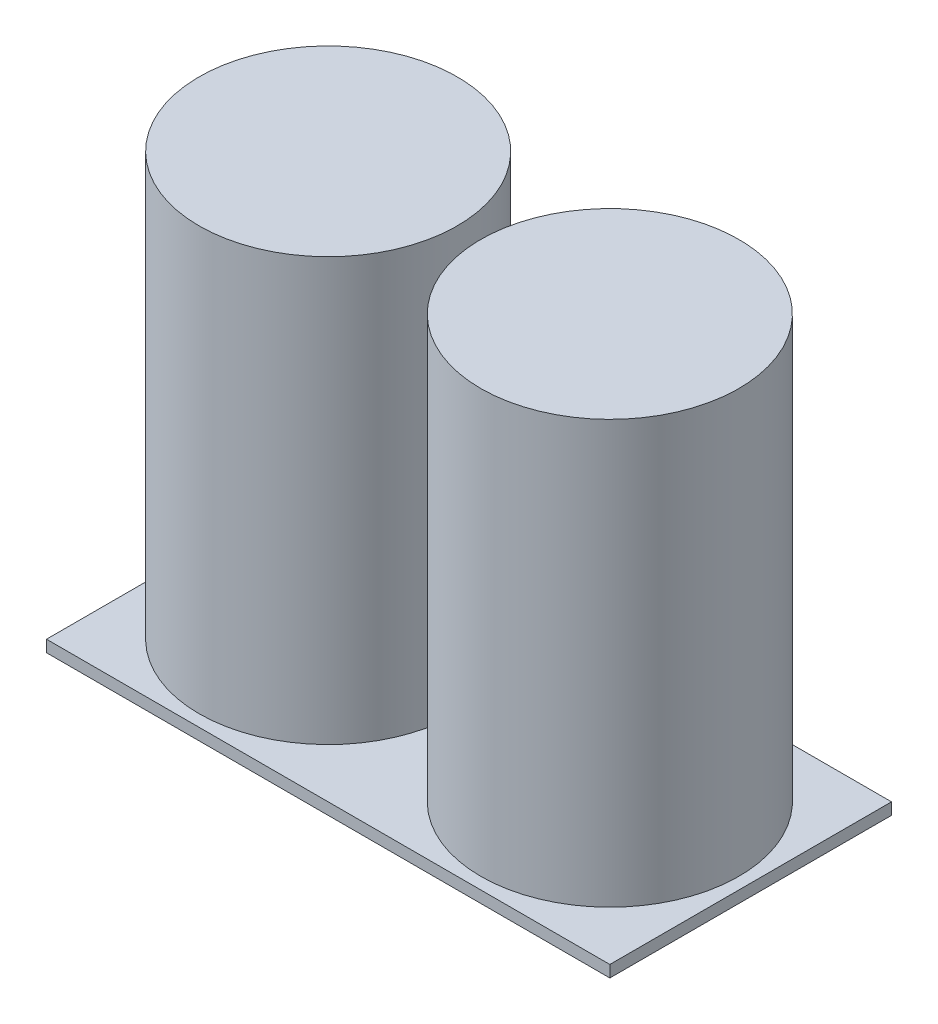
ISO-10303-21;
HEADER;
FILE_DESCRIPTION(('STEP AP214'),'2;1');
FILE_NAME('part.step','',(''),(''),'','','');
FILE_SCHEMA(('AUTOMOTIVE_DESIGN { 1 0 10303 214 1 1 1 1 }'));
ENDSEC;
DATA;
#1=APPLICATION_CONTEXT('core data for automotive mechanical design processes');
#2=APPLICATION_PROTOCOL_DEFINITION('international standard','automotive_design',2000,#1);
#3=PRODUCT_CONTEXT('',#1,'mechanical');
#4=PRODUCT('Part','Part','',(#3));
#5=PRODUCT_RELATED_PRODUCT_CATEGORY('part','',(#4));
#6=PRODUCT_DEFINITION_FORMATION('','',#4);
#7=PRODUCT_DEFINITION_CONTEXT('part definition',#1,'design');
#8=PRODUCT_DEFINITION('design','',#6,#7);
#9=PRODUCT_DEFINITION_SHAPE('','',#8);
#10=(LENGTH_UNIT() NAMED_UNIT(*) SI_UNIT(.MILLI.,.METRE.));
#11=(NAMED_UNIT(*) PLANE_ANGLE_UNIT() SI_UNIT($,.RADIAN.));
#12=(NAMED_UNIT(*) SI_UNIT($,.STERADIAN.) SOLID_ANGLE_UNIT());
#13=UNCERTAINTY_MEASURE_WITH_UNIT(LENGTH_MEASURE(1.E-05),#10,'distance_accuracy_value','');
#14=(GEOMETRIC_REPRESENTATION_CONTEXT(3) GLOBAL_UNCERTAINTY_ASSIGNED_CONTEXT((#13)) GLOBAL_UNIT_ASSIGNED_CONTEXT((#10,
#11,#12)) REPRESENTATION_CONTEXT('',''));
#15=CARTESIAN_POINT('',(0.,0.,0.));
#16=DIRECTION('',(0.,0.,1.));
#17=DIRECTION('',(1.,0.,0.));
#18=AXIS2_PLACEMENT_3D('',#15,#16,#17);
#19=CARTESIAN_POINT('',(609.6,25.4,-304.8));
#20=DIRECTION('',(-1.,0.,0.));
#21=DIRECTION('',(0.,0.,1.));
#22=AXIS2_PLACEMENT_3D('',#19,#20,#21);
#23=PLANE('',#22);
#24=DIRECTION('',(0.,0.,-1.));
#25=VECTOR('',#24,1.);
#26=CARTESIAN_POINT('',(609.6,0.,-304.8));
#27=LINE('',#26,#25);
#28=CARTESIAN_POINT('',(609.6,0.,304.8));
#29=VERTEX_POINT('',#28);
#30=CARTESIAN_POINT('',(609.6,0.,-304.8));
#31=VERTEX_POINT('',#30);
#32=EDGE_CURVE('E107',#29,#31,#27,.T.);
#33=ORIENTED_EDGE('',*,*,#32,.T.);
#34=DIRECTION('',(0.,-1.,0.));
#35=VECTOR('',#34,1.);
#36=CARTESIAN_POINT('',(609.6,25.4,-304.8));
#37=LINE('',#36,#35);
#38=CARTESIAN_POINT('',(609.6,25.4,-304.8));
#39=VERTEX_POINT('',#38);
#40=EDGE_CURVE('E11',#39,#31,#37,.T.);
#41=ORIENTED_EDGE('',*,*,#40,.F.);
#42=DIRECTION('',(0.,0.,-1.));
#43=VECTOR('',#42,1.);
#44=CARTESIAN_POINT('',(609.6,25.4,-304.8));
#45=LINE('',#44,#43);
#46=CARTESIAN_POINT('',(609.6,25.4,304.8));
#47=VERTEX_POINT('',#46);
#48=EDGE_CURVE('E91',#47,#39,#45,.T.);
#49=ORIENTED_EDGE('',*,*,#48,.F.);
#50=DIRECTION('',(0.,-1.,0.));
#51=VECTOR('',#50,1.);
#52=CARTESIAN_POINT('',(609.6,25.4,304.8));
#53=LINE('',#52,#51);
#54=EDGE_CURVE('E103',#47,#29,#53,.T.);
#55=ORIENTED_EDGE('',*,*,#54,.T.);
#56=EDGE_LOOP('',(#33,#41,#49,#55));
#57=FACE_BOUND('',#56,.T.);
#58=ADVANCED_FACE('F39',(#57),#23,.F.);
#59=CARTESIAN_POINT('',(-609.6,25.4,-304.8));
#60=DIRECTION('',(0.,0.,1.));
#61=DIRECTION('',(1.,0.,0.));
#62=AXIS2_PLACEMENT_3D('',#59,#60,#61);
#63=PLANE('',#62);
#64=DIRECTION('',(-1.,0.,0.));
#65=VECTOR('',#64,1.);
#66=CARTESIAN_POINT('',(-609.6,0.,-304.8));
#67=LINE('',#66,#65);
#68=CARTESIAN_POINT('',(-609.6,0.,-304.8));
#69=VERTEX_POINT('',#68);
#70=EDGE_CURVE('E96',#31,#69,#67,.T.);
#71=ORIENTED_EDGE('',*,*,#70,.T.);
#72=DIRECTION('',(0.,-1.,0.));
#73=VECTOR('',#72,1.);
#74=CARTESIAN_POINT('',(-609.6,25.4,-304.8));
#75=LINE('',#74,#73);
#76=CARTESIAN_POINT('',(-609.6,25.4,-304.8));
#77=VERTEX_POINT('',#76);
#78=EDGE_CURVE('E48',#77,#69,#75,.T.);
#79=ORIENTED_EDGE('',*,*,#78,.F.);
#80=DIRECTION('',(-1.,0.,0.));
#81=VECTOR('',#80,1.);
#82=CARTESIAN_POINT('',(-609.6,25.4,-304.8));
#83=LINE('',#82,#81);
#84=EDGE_CURVE('E86',#39,#77,#83,.T.);
#85=ORIENTED_EDGE('',*,*,#84,.F.);
#86=ORIENTED_EDGE('',*,*,#40,.T.);
#87=EDGE_LOOP('',(#71,#79,#85,#86));
#88=FACE_BOUND('',#87,.T.);
#89=ADVANCED_FACE('F95',(#88),#63,.F.);
#90=CARTESIAN_POINT('',(-609.6,25.4,-304.8));
#91=DIRECTION('',(1.,0.,0.));
#92=DIRECTION('',(0.,0.,-1.));
#93=AXIS2_PLACEMENT_3D('',#90,#91,#92);
#94=PLANE('',#93);
#95=DIRECTION('',(0.,0.,1.));
#96=VECTOR('',#95,1.);
#97=CARTESIAN_POINT('',(-609.6,0.,-304.8));
#98=LINE('',#97,#96);
#99=CARTESIAN_POINT('',(-609.6,0.,304.8));
#100=VERTEX_POINT('',#99);
#101=EDGE_CURVE('E73',#69,#100,#98,.T.);
#102=ORIENTED_EDGE('',*,*,#101,.T.);
#103=DIRECTION('',(0.,-1.,0.));
#104=VECTOR('',#103,1.);
#105=CARTESIAN_POINT('',(-609.6,25.4,304.8));
#106=LINE('',#105,#104);
#107=CARTESIAN_POINT('',(-609.6,25.4,304.8));
#108=VERTEX_POINT('',#107);
#109=EDGE_CURVE('E98',#108,#100,#106,.T.);
#110=ORIENTED_EDGE('',*,*,#109,.F.);
#111=DIRECTION('',(0.,0.,1.));
#112=VECTOR('',#111,1.);
#113=CARTESIAN_POINT('',(-609.6,25.4,-304.8));
#114=LINE('',#113,#112);
#115=EDGE_CURVE('E89',#77,#108,#114,.T.);
#116=ORIENTED_EDGE('',*,*,#115,.F.);
#117=ORIENTED_EDGE('',*,*,#78,.T.);
#118=EDGE_LOOP('',(#102,#110,#116,#117));
#119=FACE_BOUND('',#118,.T.);
#120=ADVANCED_FACE('F99',(#119),#94,.F.);
#121=CARTESIAN_POINT('',(-609.6,25.4,304.8));
#122=DIRECTION('',(0.,0.,-1.));
#123=DIRECTION('',(-1.,0.,0.));
#124=AXIS2_PLACEMENT_3D('',#121,#122,#123);
#125=PLANE('',#124);
#126=DIRECTION('',(1.,0.,0.));
#127=VECTOR('',#126,1.);
#128=CARTESIAN_POINT('',(-609.6,0.,304.8));
#129=LINE('',#128,#127);
#130=EDGE_CURVE('E79',#100,#29,#129,.T.);
#131=ORIENTED_EDGE('',*,*,#130,.T.);
#132=ORIENTED_EDGE('',*,*,#54,.F.);
#133=DIRECTION('',(1.,0.,0.));
#134=VECTOR('',#133,1.);
#135=CARTESIAN_POINT('',(-609.6,25.4,304.8));
#136=LINE('',#135,#134);
#137=EDGE_CURVE('E56',#108,#47,#136,.T.);
#138=ORIENTED_EDGE('',*,*,#137,.F.);
#139=ORIENTED_EDGE('',*,*,#109,.T.);
#140=EDGE_LOOP('',(#131,#132,#138,#139));
#141=FACE_BOUND('',#140,.T.);
#142=ADVANCED_FACE('F121',(#141),#125,.F.);
#143=CARTESIAN_POINT('',(0.,25.4,0.));
#144=DIRECTION('',(0.,1.,0.));
#145=DIRECTION('',(0.,0.,1.));
#146=AXIS2_PLACEMENT_3D('',#143,#144,#145);
#147=PLANE('',#146);
#148=CARTESIAN_POINT('',(304.8,25.4,0.));
#149=DIRECTION('',(0.,1.,0.));
#150=DIRECTION('',(0.,0.,1.));
#151=AXIS2_PLACEMENT_3D('',#148,#149,#150);
#152=CIRCLE('',#151,279.4);
#153=CARTESIAN_POINT('',(304.8,25.4,279.4));
#154=VERTEX_POINT('',#153);
#155=EDGE_CURVE('E136',#154,#154,#152,.T.);
#156=ORIENTED_EDGE('',*,*,#155,.F.);
#157=EDGE_LOOP('',(#156));
#158=FACE_BOUND('',#157,.T.);
#159=CARTESIAN_POINT('',(-304.8,25.4,0.));
#160=DIRECTION('',(0.,1.,0.));
#161=DIRECTION('',(0.,0.,1.));
#162=AXIS2_PLACEMENT_3D('',#159,#160,#161);
#163=CIRCLE('',#162,279.4);
#164=CARTESIAN_POINT('',(-304.8,25.4,279.4));
#165=VERTEX_POINT('',#164);
#166=EDGE_CURVE('E128',#165,#165,#163,.T.);
#167=ORIENTED_EDGE('',*,*,#166,.F.);
#168=EDGE_LOOP('',(#167));
#169=FACE_BOUND('',#168,.T.);
#170=ORIENTED_EDGE('',*,*,#48,.T.);
#171=ORIENTED_EDGE('',*,*,#84,.T.);
#172=ORIENTED_EDGE('',*,*,#115,.T.);
#173=ORIENTED_EDGE('',*,*,#137,.T.);
#174=EDGE_LOOP('',(#170,#171,#172,#173));
#175=FACE_BOUND('',#174,.T.);
#176=ADVANCED_FACE('F87',(#158,#169,#175),#147,.T.);
#177=CARTESIAN_POINT('',(0.,0.,0.));
#178=DIRECTION('',(0.,1.,0.));
#179=DIRECTION('',(0.,0.,1.));
#180=AXIS2_PLACEMENT_3D('',#177,#178,#179);
#181=PLANE('',#180);
#182=ORIENTED_EDGE('',*,*,#32,.F.);
#183=ORIENTED_EDGE('',*,*,#130,.F.);
#184=ORIENTED_EDGE('',*,*,#101,.F.);
#185=ORIENTED_EDGE('',*,*,#70,.F.);
#186=EDGE_LOOP('',(#182,#183,#184,#185));
#187=FACE_BOUND('',#186,.T.);
#188=ADVANCED_FACE('F124',(#187),#181,.F.);
#189=CARTESIAN_POINT('',(-304.8,939.8,0.));
#190=DIRECTION('',(0.,-1.,0.));
#191=DIRECTION('',(0.,0.,-1.));
#192=AXIS2_PLACEMENT_3D('',#189,#190,#191);
#193=CYLINDRICAL_SURFACE('',#192,279.4);
#194=CARTESIAN_POINT('',(-304.8,939.8,0.));
#195=DIRECTION('',(0.,1.,0.));
#196=DIRECTION('',(0.,0.,1.));
#197=AXIS2_PLACEMENT_3D('',#194,#195,#196);
#198=CIRCLE('',#197,279.4);
#199=CARTESIAN_POINT('',(-304.8,939.8,279.4));
#200=VERTEX_POINT('',#199);
#201=EDGE_CURVE('E111',#200,#200,#198,.T.);
#202=ORIENTED_EDGE('',*,*,#201,.F.);
#203=EDGE_LOOP('',(#202));
#204=FACE_BOUND('',#203,.T.);
#205=ORIENTED_EDGE('',*,*,#166,.T.);
#206=EDGE_LOOP('',(#205));
#207=FACE_BOUND('',#206,.T.);
#208=ADVANCED_FACE('F158',(#204,#207),#193,.T.);
#209=CARTESIAN_POINT('',(-304.8,939.8,0.));
#210=DIRECTION('',(0.,1.,0.));
#211=DIRECTION('',(0.,0.,1.));
#212=AXIS2_PLACEMENT_3D('',#209,#210,#211);
#213=PLANE('',#212);
#214=ORIENTED_EDGE('',*,*,#201,.T.);
#215=EDGE_LOOP('',(#214));
#216=FACE_BOUND('',#215,.T.);
#217=ADVANCED_FACE('F149',(#216),#213,.T.);
#218=CARTESIAN_POINT('',(304.8,939.8,0.));
#219=DIRECTION('',(0.,-1.,0.));
#220=DIRECTION('',(0.,0.,-1.));
#221=AXIS2_PLACEMENT_3D('',#218,#219,#220);
#222=CYLINDRICAL_SURFACE('',#221,279.4);
#223=CARTESIAN_POINT('',(304.8,939.8,0.));
#224=DIRECTION('',(0.,1.,0.));
#225=DIRECTION('',(0.,0.,1.));
#226=AXIS2_PLACEMENT_3D('',#223,#224,#225);
#227=CIRCLE('',#226,279.4);
#228=CARTESIAN_POINT('',(304.8,939.8,279.4));
#229=VERTEX_POINT('',#228);
#230=EDGE_CURVE('E132',#229,#229,#227,.T.);
#231=ORIENTED_EDGE('',*,*,#230,.F.);
#232=EDGE_LOOP('',(#231));
#233=FACE_BOUND('',#232,.T.);
#234=ORIENTED_EDGE('',*,*,#155,.T.);
#235=EDGE_LOOP('',(#234));
#236=FACE_BOUND('',#235,.T.);
#237=ADVANCED_FACE('F146',(#233,#236),#222,.T.);
#238=CARTESIAN_POINT('',(304.8,939.8,0.));
#239=DIRECTION('',(0.,1.,0.));
#240=DIRECTION('',(0.,0.,1.));
#241=AXIS2_PLACEMENT_3D('',#238,#239,#240);
#242=PLANE('',#241);
#243=ORIENTED_EDGE('',*,*,#230,.T.);
#244=EDGE_LOOP('',(#243));
#245=FACE_BOUND('',#244,.T.);
#246=ADVANCED_FACE('F144',(#245),#242,.T.);
#247=CLOSED_SHELL('',(#58,#89,#120,#142,#176,#188,#208,#217,#237,#246));
#248=MANIFOLD_SOLID_BREP('B2',#247);
#249=ADVANCED_BREP_SHAPE_REPRESENTATION('',(#18,#248),#14);
#250=SHAPE_DEFINITION_REPRESENTATION(#9,#249);
ENDSEC;
END-ISO-10303-21;
